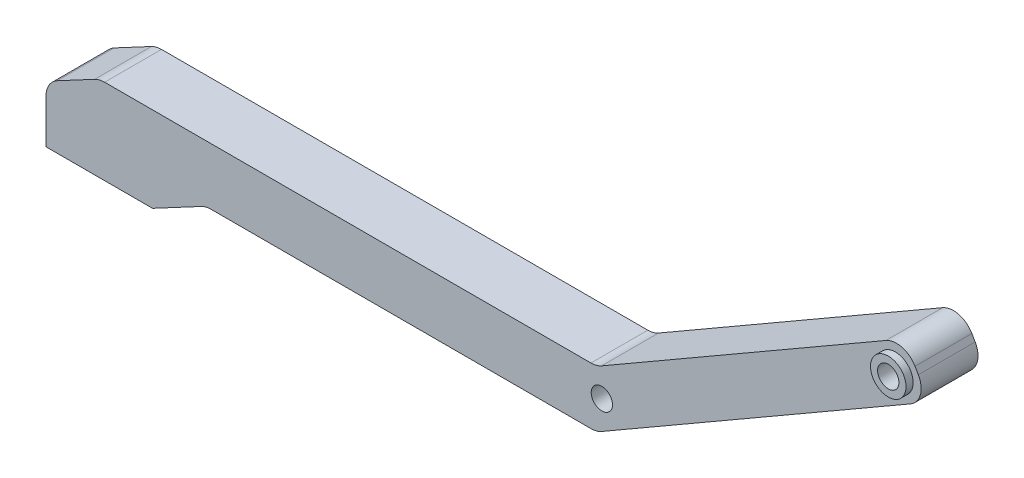
ISO-10303-21;
HEADER;
FILE_DESCRIPTION(('STEP AP214'),'2;1');
FILE_NAME('part.step','',(''),(''),'','','');
FILE_SCHEMA(('AUTOMOTIVE_DESIGN { 1 0 10303 214 1 1 1 1 }'));
ENDSEC;
DATA;
#1=APPLICATION_CONTEXT('core data for automotive mechanical design processes');
#2=APPLICATION_PROTOCOL_DEFINITION('international standard','automotive_design',2000,#1);
#3=PRODUCT_CONTEXT('',#1,'mechanical');
#4=PRODUCT('Part','Part','',(#3));
#5=PRODUCT_RELATED_PRODUCT_CATEGORY('part','',(#4));
#6=PRODUCT_DEFINITION_FORMATION('','',#4);
#7=PRODUCT_DEFINITION_CONTEXT('part definition',#1,'design');
#8=PRODUCT_DEFINITION('design','',#6,#7);
#9=PRODUCT_DEFINITION_SHAPE('','',#8);
#10=(LENGTH_UNIT() NAMED_UNIT(*) SI_UNIT(.MILLI.,.METRE.));
#11=(NAMED_UNIT(*) PLANE_ANGLE_UNIT() SI_UNIT($,.RADIAN.));
#12=(NAMED_UNIT(*) SI_UNIT($,.STERADIAN.) SOLID_ANGLE_UNIT());
#13=UNCERTAINTY_MEASURE_WITH_UNIT(LENGTH_MEASURE(1.E-05),#10,'distance_accuracy_value','');
#14=(GEOMETRIC_REPRESENTATION_CONTEXT(3) GLOBAL_UNCERTAINTY_ASSIGNED_CONTEXT((#13)) GLOBAL_UNIT_ASSIGNED_CONTEXT((#10,
#11,#12)) REPRESENTATION_CONTEXT('',''));
#15=CARTESIAN_POINT('',(0.,0.,0.));
#16=DIRECTION('',(0.,0.,1.));
#17=DIRECTION('',(1.,0.,0.));
#18=AXIS2_PLACEMENT_3D('',#15,#16,#17);
#19=CARTESIAN_POINT('',(0.,0.,8.));
#20=DIRECTION('',(0.,0.,1.));
#21=DIRECTION('',(1.,0.,0.));
#22=AXIS2_PLACEMENT_3D('',#19,#20,#21);
#23=PLANE('',#22);
#24=CARTESIAN_POINT('',(70.727461339179,4.42000000000001,8.));
#25=DIRECTION('',(0.,0.,1.));
#26=DIRECTION('',(1.,0.,0.));
#27=AXIS2_PLACEMENT_3D('',#24,#25,#26);
#28=CIRCLE('',#27,1.5);
#29=CARTESIAN_POINT('',(72.227461339179,4.42000000000001,8.));
#30=VERTEX_POINT('',#29);
#31=EDGE_CURVE('E351',#30,#30,#28,.T.);
#32=ORIENTED_EDGE('',*,*,#31,.F.);
#33=EDGE_LOOP('',(#32));
#34=FACE_BOUND('',#33,.T.);
#35=DIRECTION('',(-0.500000000000005,0.866025403784436,0.));
#36=VECTOR('',#35,1.);
#37=CARTESIAN_POINT('',(116.76537180436,27.,8.));
#38=LINE('',#37,#36);
#39=CARTESIAN_POINT('',(115.26537180436,29.5980762113533,8.));
#40=VERTEX_POINT('',#39);
#41=CARTESIAN_POINT('',(114.801270189222,30.4019237886467,8.));
#42=VERTEX_POINT('',#41);
#43=EDGE_CURVE('E333',#40,#42,#38,.T.);
#44=ORIENTED_EDGE('',*,*,#43,.T.);
#45=CARTESIAN_POINT('',(112.203193977869,28.9019237886467,8.));
#46=DIRECTION('',(0.,0.,1.));
#47=DIRECTION('',(1.,0.,0.));
#48=AXIS2_PLACEMENT_3D('',#45,#46,#47);
#49=CIRCLE('',#48,3.);
#50=CARTESIAN_POINT('',(110.703193977869,31.5,8.));
#51=VERTEX_POINT('',#50);
#52=EDGE_CURVE('E274',#42,#51,#49,.T.);
#53=ORIENTED_EDGE('',*,*,#52,.T.);
#54=DIRECTION('',(-0.866025403784439,-0.5,0.));
#55=VECTOR('',#54,1.);
#56=CARTESIAN_POINT('',(70.,8.,8.));
#57=LINE('',#56,#55);
#58=CARTESIAN_POINT('',(70.6961524227066,8.40192378864668,8.));
#59=VERTEX_POINT('',#58);
#60=EDGE_CURVE('E325',#51,#59,#57,.T.);
#61=ORIENTED_EDGE('',*,*,#60,.T.);
#62=CARTESIAN_POINT('',(69.1961524227066,11.,8.));
#63=DIRECTION('',(0.,0.,1.));
#64=DIRECTION('',(1.,0.,0.));
#65=AXIS2_PLACEMENT_3D('',#62,#63,#64);
#66=CIRCLE('',#65,3.);
#67=CARTESIAN_POINT('',(69.1961524227066,8.,8.));
#68=VERTEX_POINT('',#67);
#69=EDGE_CURVE('E11',#59,#68,#66,.F.);
#70=ORIENTED_EDGE('',*,*,#69,.T.);
#71=DIRECTION('',(-1.,0.,0.));
#72=VECTOR('',#71,1.);
#73=CARTESIAN_POINT('',(0.,8.,8.));
#74=LINE('',#73,#72);
#75=CARTESIAN_POINT('',(0.749999999999998,8.,8.));
#76=VERTEX_POINT('',#75);
#77=EDGE_CURVE('E323',#68,#76,#74,.T.);
#78=ORIENTED_EDGE('',*,*,#77,.T.);
#79=CARTESIAN_POINT('',(0.749999999999998,5.,8.));
#80=DIRECTION('',(0.,0.,1.));
#81=DIRECTION('',(1.,0.,0.));
#82=AXIS2_PLACEMENT_3D('',#79,#80,#81);
#83=CIRCLE('',#82,3.);
#84=CARTESIAN_POINT('',(-0.661764705882354,7.64705882352941,8.));
#85=VERTEX_POINT('',#84);
#86=EDGE_CURVE('E265',#76,#85,#83,.T.);
#87=ORIENTED_EDGE('',*,*,#86,.T.);
#88=DIRECTION('',(-0.882352941176471,-0.470588235294118,0.));
#89=VECTOR('',#88,1.);
#90=CARTESIAN_POINT('',(0.,8.,8.));
#91=LINE('',#90,#89);
#92=CARTESIAN_POINT('',(-5.91176470588236,4.84705882352941,8.));
#93=VERTEX_POINT('',#92);
#94=EDGE_CURVE('E169',#85,#93,#91,.T.);
#95=ORIENTED_EDGE('',*,*,#94,.T.);
#96=CARTESIAN_POINT('',(-4.5,2.2,8.));
#97=DIRECTION('',(0.,0.,1.));
#98=DIRECTION('',(1.,0.,0.));
#99=AXIS2_PLACEMENT_3D('',#96,#97,#98);
#100=CIRCLE('',#99,3.);
#101=CARTESIAN_POINT('',(-7.5,2.2,8.));
#102=VERTEX_POINT('',#101);
#103=EDGE_CURVE('E61',#93,#102,#100,.T.);
#104=ORIENTED_EDGE('',*,*,#103,.T.);
#105=DIRECTION('',(0.,-1.,0.));
#106=VECTOR('',#105,1.);
#107=CARTESIAN_POINT('',(-7.5,4.,8.));
#108=LINE('',#107,#106);
#109=CARTESIAN_POINT('',(-7.5,-4.,8.));
#110=VERTEX_POINT('',#109);
#111=EDGE_CURVE('E157',#102,#110,#108,.T.);
#112=ORIENTED_EDGE('',*,*,#111,.T.);
#113=DIRECTION('',(1.,0.,0.));
#114=VECTOR('',#113,1.);
#115=CARTESIAN_POINT('',(-7.5,-4.,8.));
#116=LINE('',#115,#114);
#117=CARTESIAN_POINT('',(7.5,-4.,8.));
#118=VERTEX_POINT('',#117);
#119=EDGE_CURVE('E163',#110,#118,#116,.T.);
#120=ORIENTED_EDGE('',*,*,#119,.T.);
#121=DIRECTION('',(0.882352941176471,0.470588235294118,0.));
#122=VECTOR('',#121,1.);
#123=CARTESIAN_POINT('',(7.5,-4.,8.));
#124=LINE('',#123,#122);
#125=CARTESIAN_POINT('',(14.3382352941176,-0.352941176470585,8.));
#126=VERTEX_POINT('',#125);
#127=EDGE_CURVE('E223',#118,#126,#124,.T.);
#128=ORIENTED_EDGE('',*,*,#127,.T.);
#129=CARTESIAN_POINT('',(15.75,-3.,8.));
#130=DIRECTION('',(0.,0.,1.));
#131=DIRECTION('',(1.,0.,0.));
#132=AXIS2_PLACEMENT_3D('',#129,#130,#131);
#133=CIRCLE('',#132,3.);
#134=CARTESIAN_POINT('',(15.75,0.,8.));
#135=VERTEX_POINT('',#134);
#136=EDGE_CURVE('E303',#126,#135,#133,.F.);
#137=ORIENTED_EDGE('',*,*,#136,.T.);
#138=DIRECTION('',(1.,0.,0.));
#139=VECTOR('',#138,1.);
#140=CARTESIAN_POINT('',(15.,0.,8.));
#141=LINE('',#140,#139);
#142=CARTESIAN_POINT('',(69.1961524227066,0.,8.));
#143=VERTEX_POINT('',#142);
#144=EDGE_CURVE('E342',#135,#143,#141,.T.);
#145=ORIENTED_EDGE('',*,*,#144,.T.);
#146=CARTESIAN_POINT('',(69.1961524227066,3.,8.));
#147=DIRECTION('',(0.,0.,1.));
#148=DIRECTION('',(1.,0.,0.));
#149=AXIS2_PLACEMENT_3D('',#146,#147,#148);
#150=CIRCLE('',#149,3.);
#151=CARTESIAN_POINT('',(70.6961524227066,0.40192378864668,8.));
#152=VERTEX_POINT('',#151);
#153=EDGE_CURVE('E268',#143,#152,#150,.T.);
#154=ORIENTED_EDGE('',*,*,#153,.T.);
#155=DIRECTION('',(0.866025403784439,0.5,0.));
#156=VECTOR('',#155,1.);
#157=CARTESIAN_POINT('',(70.,0.,8.));
#158=LINE('',#157,#156);
#159=CARTESIAN_POINT('',(114.167295593006,25.5,8.));
#160=VERTEX_POINT('',#159);
#161=EDGE_CURVE('E338',#152,#160,#158,.T.);
#162=ORIENTED_EDGE('',*,*,#161,.T.);
#163=CARTESIAN_POINT('',(112.667295593006,28.0980762113533,8.));
#164=DIRECTION('',(0.,0.,1.));
#165=DIRECTION('',(1.,0.,0.));
#166=AXIS2_PLACEMENT_3D('',#163,#164,#165);
#167=CIRCLE('',#166,3.);
#168=EDGE_CURVE('E271',#160,#40,#167,.T.);
#169=ORIENTED_EDGE('',*,*,#168,.T.);
#170=EDGE_LOOP('',(#44,#53,#61,#70,#78,#87,#95,#104,#112,#120,#128,#137,#145,#154,#162,#169));
#171=FACE_BOUND('',#170,.T.);
#172=CARTESIAN_POINT('',(112.036873099697,28.27,8.));
#173=DIRECTION('',(0.,0.,1.));
#174=DIRECTION('',(1.,0.,0.));
#175=AXIS2_PLACEMENT_3D('',#172,#173,#174);
#176=CIRCLE('',#175,2.5);
#177=CARTESIAN_POINT('',(114.536873099697,28.27,8.));
#178=VERTEX_POINT('',#177);
#179=EDGE_CURVE('E360',#178,#178,#176,.T.);
#180=ORIENTED_EDGE('',*,*,#179,.F.);
#181=EDGE_LOOP('',(#180));
#182=FACE_BOUND('',#181,.T.);
#183=ADVANCED_FACE('F45',(#34,#171,#182),#23,.T.);
#184=CARTESIAN_POINT('',(0.,0.,0.));
#185=DIRECTION('',(0.,0.,1.));
#186=DIRECTION('',(1.,0.,0.));
#187=AXIS2_PLACEMENT_3D('',#184,#185,#186);
#188=PLANE('',#187);
#189=DIRECTION('',(-0.866025403784439,-0.5,0.));
#190=VECTOR('',#189,1.);
#191=CARTESIAN_POINT('',(70.,8.,0.));
#192=LINE('',#191,#190);
#193=CARTESIAN_POINT('',(110.703193977869,31.5,0.));
#194=VERTEX_POINT('',#193);
#195=CARTESIAN_POINT('',(70.6961524227066,8.40192378864668,0.));
#196=VERTEX_POINT('',#195);
#197=EDGE_CURVE('E208',#194,#196,#192,.T.);
#198=ORIENTED_EDGE('',*,*,#197,.F.);
#199=CARTESIAN_POINT('',(112.203193977869,28.9019237886467,0.));
#200=DIRECTION('',(0.,0.,1.));
#201=DIRECTION('',(1.,0.,0.));
#202=AXIS2_PLACEMENT_3D('',#199,#200,#201);
#203=CIRCLE('',#202,3.);
#204=CARTESIAN_POINT('',(114.801270189222,30.4019237886467,0.));
#205=VERTEX_POINT('',#204);
#206=EDGE_CURVE('E253',#194,#205,#203,.F.);
#207=ORIENTED_EDGE('',*,*,#206,.T.);
#208=DIRECTION('',(-0.500000000000005,0.866025403784436,0.));
#209=VECTOR('',#208,1.);
#210=CARTESIAN_POINT('',(116.76537180436,27.,0.));
#211=LINE('',#210,#209);
#212=CARTESIAN_POINT('',(115.26537180436,29.5980762113533,0.));
#213=VERTEX_POINT('',#212);
#214=EDGE_CURVE('E204',#213,#205,#211,.T.);
#215=ORIENTED_EDGE('',*,*,#214,.F.);
#216=CARTESIAN_POINT('',(112.667295593006,28.0980762113533,0.));
#217=DIRECTION('',(0.,0.,1.));
#218=DIRECTION('',(1.,0.,0.));
#219=AXIS2_PLACEMENT_3D('',#216,#217,#218);
#220=CIRCLE('',#219,3.);
#221=CARTESIAN_POINT('',(114.167295593006,25.5,0.));
#222=VERTEX_POINT('',#221);
#223=EDGE_CURVE('E250',#213,#222,#220,.F.);
#224=ORIENTED_EDGE('',*,*,#223,.T.);
#225=DIRECTION('',(0.866025403784439,0.5,0.));
#226=VECTOR('',#225,1.);
#227=CARTESIAN_POINT('',(70.,0.,0.));
#228=LINE('',#227,#226);
#229=CARTESIAN_POINT('',(70.6961524227066,0.40192378864668,0.));
#230=VERTEX_POINT('',#229);
#231=EDGE_CURVE('E200',#230,#222,#228,.T.);
#232=ORIENTED_EDGE('',*,*,#231,.F.);
#233=CARTESIAN_POINT('',(69.1961524227066,3.,0.));
#234=DIRECTION('',(0.,0.,1.));
#235=DIRECTION('',(1.,0.,0.));
#236=AXIS2_PLACEMENT_3D('',#233,#234,#235);
#237=CIRCLE('',#236,3.);
#238=CARTESIAN_POINT('',(69.1961524227066,0.,0.));
#239=VERTEX_POINT('',#238);
#240=EDGE_CURVE('E247',#230,#239,#237,.F.);
#241=ORIENTED_EDGE('',*,*,#240,.T.);
#242=DIRECTION('',(1.,0.,0.));
#243=VECTOR('',#242,1.);
#244=CARTESIAN_POINT('',(15.,0.,0.));
#245=LINE('',#244,#243);
#246=CARTESIAN_POINT('',(15.75,0.,0.));
#247=VERTEX_POINT('',#246);
#248=EDGE_CURVE('E195',#247,#239,#245,.T.);
#249=ORIENTED_EDGE('',*,*,#248,.F.);
#250=CARTESIAN_POINT('',(15.75,-3.,0.));
#251=DIRECTION('',(0.,0.,1.));
#252=DIRECTION('',(1.,0.,0.));
#253=AXIS2_PLACEMENT_3D('',#250,#251,#252);
#254=CIRCLE('',#253,3.);
#255=CARTESIAN_POINT('',(14.3382352941176,-0.352941176470585,0.));
#256=VERTEX_POINT('',#255);
#257=EDGE_CURVE('E300',#247,#256,#254,.T.);
#258=ORIENTED_EDGE('',*,*,#257,.T.);
#259=DIRECTION('',(0.882352941176471,0.470588235294118,0.));
#260=VECTOR('',#259,1.);
#261=CARTESIAN_POINT('',(7.5,-4.,0.));
#262=LINE('',#261,#260);
#263=CARTESIAN_POINT('',(7.5,-4.,0.));
#264=VERTEX_POINT('',#263);
#265=EDGE_CURVE('E191',#264,#256,#262,.T.);
#266=ORIENTED_EDGE('',*,*,#265,.F.);
#267=DIRECTION('',(1.,0.,0.));
#268=VECTOR('',#267,1.);
#269=CARTESIAN_POINT('',(-7.5,-4.,0.));
#270=LINE('',#269,#268);
#271=CARTESIAN_POINT('',(-7.5,-4.,0.));
#272=VERTEX_POINT('',#271);
#273=EDGE_CURVE('E221',#272,#264,#270,.T.);
#274=ORIENTED_EDGE('',*,*,#273,.F.);
#275=DIRECTION('',(0.,-1.,0.));
#276=VECTOR('',#275,1.);
#277=CARTESIAN_POINT('',(-7.5,4.,0.));
#278=LINE('',#277,#276);
#279=CARTESIAN_POINT('',(-7.5,2.2,0.));
#280=VERTEX_POINT('',#279);
#281=EDGE_CURVE('E175',#280,#272,#278,.T.);
#282=ORIENTED_EDGE('',*,*,#281,.F.);
#283=CARTESIAN_POINT('',(-4.5,2.2,0.));
#284=DIRECTION('',(0.,0.,1.));
#285=DIRECTION('',(1.,0.,0.));
#286=AXIS2_PLACEMENT_3D('',#283,#284,#285);
#287=CIRCLE('',#286,3.);
#288=CARTESIAN_POINT('',(-5.91176470588236,4.84705882352941,0.));
#289=VERTEX_POINT('',#288);
#290=EDGE_CURVE('E241',#280,#289,#287,.F.);
#291=ORIENTED_EDGE('',*,*,#290,.T.);
#292=DIRECTION('',(-0.882352941176471,-0.470588235294118,0.));
#293=VECTOR('',#292,1.);
#294=CARTESIAN_POINT('',(0.,8.,0.));
#295=LINE('',#294,#293);
#296=CARTESIAN_POINT('',(-0.661764705882354,7.64705882352941,0.));
#297=VERTEX_POINT('',#296);
#298=EDGE_CURVE('E216',#297,#289,#295,.T.);
#299=ORIENTED_EDGE('',*,*,#298,.F.);
#300=CARTESIAN_POINT('',(0.749999999999998,5.,0.));
#301=DIRECTION('',(0.,0.,1.));
#302=DIRECTION('',(1.,0.,0.));
#303=AXIS2_PLACEMENT_3D('',#300,#301,#302);
#304=CIRCLE('',#303,3.);
#305=CARTESIAN_POINT('',(0.749999999999998,8.,0.));
#306=VERTEX_POINT('',#305);
#307=EDGE_CURVE('E244',#297,#306,#304,.F.);
#308=ORIENTED_EDGE('',*,*,#307,.T.);
#309=DIRECTION('',(-1.,0.,0.));
#310=VECTOR('',#309,1.);
#311=CARTESIAN_POINT('',(0.,8.,0.));
#312=LINE('',#311,#310);
#313=CARTESIAN_POINT('',(69.1961524227066,8.,0.));
#314=VERTEX_POINT('',#313);
#315=EDGE_CURVE('E212',#314,#306,#312,.T.);
#316=ORIENTED_EDGE('',*,*,#315,.F.);
#317=CARTESIAN_POINT('',(69.1961524227066,11.,0.));
#318=DIRECTION('',(0.,0.,1.));
#319=DIRECTION('',(1.,0.,0.));
#320=AXIS2_PLACEMENT_3D('',#317,#318,#319);
#321=CIRCLE('',#320,3.);
#322=EDGE_CURVE('E54',#314,#196,#321,.T.);
#323=ORIENTED_EDGE('',*,*,#322,.T.);
#324=EDGE_LOOP('',(#198,#207,#215,#224,#232,#241,#249,#258,#266,#274,#282,#291,#299,#308,#316,#323));
#325=FACE_BOUND('',#324,.T.);
#326=CARTESIAN_POINT('',(112.036873099697,28.27,0.));
#327=DIRECTION('',(0.,0.,1.));
#328=DIRECTION('',(1.,0.,0.));
#329=AXIS2_PLACEMENT_3D('',#326,#327,#328);
#330=CIRCLE('',#329,1.5);
#331=CARTESIAN_POINT('',(113.536873099697,28.27,0.));
#332=VERTEX_POINT('',#331);
#333=EDGE_CURVE('E196',#332,#332,#330,.T.);
#334=ORIENTED_EDGE('',*,*,#333,.T.);
#335=EDGE_LOOP('',(#334));
#336=FACE_BOUND('',#335,.T.);
#337=CARTESIAN_POINT('',(70.727461339179,4.42000000000001,0.));
#338=DIRECTION('',(0.,0.,1.));
#339=DIRECTION('',(1.,0.,0.));
#340=AXIS2_PLACEMENT_3D('',#337,#338,#339);
#341=CIRCLE('',#340,1.5);
#342=CARTESIAN_POINT('',(72.227461339179,4.42000000000001,0.));
#343=VERTEX_POINT('',#342);
#344=EDGE_CURVE('E352',#343,#343,#341,.T.);
#345=ORIENTED_EDGE('',*,*,#344,.T.);
#346=EDGE_LOOP('',(#345));
#347=FACE_BOUND('',#346,.T.);
#348=ADVANCED_FACE('F309',(#325,#336,#347),#188,.F.);
#349=CARTESIAN_POINT('',(7.5,-4.,8.));
#350=DIRECTION('',(-0.470588235294118,0.88235294117647,0.));
#351=DIRECTION('',(-0.882352941176471,-0.470588235294118,0.));
#352=AXIS2_PLACEMENT_3D('',#349,#350,#351);
#353=PLANE('',#352);
#354=ORIENTED_EDGE('',*,*,#265,.T.);
#355=DIRECTION('',(0.,0.,-1.));
#356=VECTOR('',#355,1.);
#357=CARTESIAN_POINT('',(14.3382352941176,-0.352941176470586,8.));
#358=LINE('',#357,#356);
#359=EDGE_CURVE('E231',#256,#126,#358,.F.);
#360=ORIENTED_EDGE('',*,*,#359,.T.);
#361=ORIENTED_EDGE('',*,*,#127,.F.);
#362=DIRECTION('',(0.,0.,-1.));
#363=VECTOR('',#362,1.);
#364=CARTESIAN_POINT('',(7.5,-4.,8.));
#365=LINE('',#364,#363);
#366=EDGE_CURVE('E180',#118,#264,#365,.T.);
#367=ORIENTED_EDGE('',*,*,#366,.T.);
#368=EDGE_LOOP('',(#354,#360,#361,#367));
#369=FACE_BOUND('',#368,.T.);
#370=ADVANCED_FACE('F394',(#369),#353,.F.);
#371=CARTESIAN_POINT('',(15.,0.,8.));
#372=DIRECTION('',(0.,1.,0.));
#373=DIRECTION('',(-1.,0.,0.));
#374=AXIS2_PLACEMENT_3D('',#371,#372,#373);
#375=PLANE('',#374);
#376=ORIENTED_EDGE('',*,*,#144,.F.);
#377=DIRECTION('',(0.,0.,-1.));
#378=VECTOR('',#377,1.);
#379=CARTESIAN_POINT('',(15.75,0.,0.));
#380=LINE('',#379,#378);
#381=EDGE_CURVE('E227',#135,#247,#380,.T.);
#382=ORIENTED_EDGE('',*,*,#381,.T.);
#383=ORIENTED_EDGE('',*,*,#248,.T.);
#384=DIRECTION('',(0.,0.,-1.));
#385=VECTOR('',#384,1.);
#386=CARTESIAN_POINT('',(69.1961524227066,0.,8.));
#387=LINE('',#386,#385);
#388=EDGE_CURVE('E179',#239,#143,#387,.F.);
#389=ORIENTED_EDGE('',*,*,#388,.T.);
#390=EDGE_LOOP('',(#376,#382,#383,#389));
#391=FACE_BOUND('',#390,.T.);
#392=ADVANCED_FACE('F418',(#391),#375,.F.);
#393=CARTESIAN_POINT('',(70.,0.,8.));
#394=DIRECTION('',(-0.5,0.866025403784439,0.));
#395=DIRECTION('',(-0.866025403784439,-0.5,0.));
#396=AXIS2_PLACEMENT_3D('',#393,#394,#395);
#397=PLANE('',#396);
#398=ORIENTED_EDGE('',*,*,#231,.T.);
#399=DIRECTION('',(0.,0.,-1.));
#400=VECTOR('',#399,1.);
#401=CARTESIAN_POINT('',(114.167295593006,25.5,8.));
#402=LINE('',#401,#400);
#403=EDGE_CURVE('E281',#222,#160,#402,.F.);
#404=ORIENTED_EDGE('',*,*,#403,.T.);
#405=ORIENTED_EDGE('',*,*,#161,.F.);
#406=DIRECTION('',(0.,0.,-1.));
#407=VECTOR('',#406,1.);
#408=CARTESIAN_POINT('',(70.6961524227066,0.401923788646679,8.));
#409=LINE('',#408,#407);
#410=EDGE_CURVE('E277',#152,#230,#409,.T.);
#411=ORIENTED_EDGE('',*,*,#410,.T.);
#412=EDGE_LOOP('',(#398,#404,#405,#411));
#413=FACE_BOUND('',#412,.T.);
#414=ADVANCED_FACE('F414',(#413),#397,.F.);
#415=CARTESIAN_POINT('',(116.76537180436,27.,8.));
#416=DIRECTION('',(-0.866025403784436,-0.500000000000004,0.));
#417=DIRECTION('',(0.500000000000005,-0.866025403784436,0.));
#418=AXIS2_PLACEMENT_3D('',#415,#416,#417);
#419=PLANE('',#418);
#420=ORIENTED_EDGE('',*,*,#214,.T.);
#421=DIRECTION('',(0.,0.,-1.));
#422=VECTOR('',#421,1.);
#423=CARTESIAN_POINT('',(114.801270189222,30.4019237886467,8.));
#424=LINE('',#423,#422);
#425=EDGE_CURVE('E260',#205,#42,#424,.F.);
#426=ORIENTED_EDGE('',*,*,#425,.T.);
#427=ORIENTED_EDGE('',*,*,#43,.F.);
#428=DIRECTION('',(0.,0.,-1.));
#429=VECTOR('',#428,1.);
#430=CARTESIAN_POINT('',(115.26537180436,29.5980762113533,8.));
#431=LINE('',#430,#429);
#432=EDGE_CURVE('E256',#40,#213,#431,.T.);
#433=ORIENTED_EDGE('',*,*,#432,.T.);
#434=EDGE_LOOP('',(#420,#426,#427,#433));
#435=FACE_BOUND('',#434,.T.);
#436=ADVANCED_FACE('F411',(#435),#419,.F.);
#437=CARTESIAN_POINT('',(70.,8.,8.));
#438=DIRECTION('',(0.5,-0.866025403784439,0.));
#439=DIRECTION('',(0.866025403784439,0.5,0.));
#440=AXIS2_PLACEMENT_3D('',#437,#438,#439);
#441=PLANE('',#440);
#442=ORIENTED_EDGE('',*,*,#60,.F.);
#443=DIRECTION('',(0.,0.,-1.));
#444=VECTOR('',#443,1.);
#445=CARTESIAN_POINT('',(110.703193977869,31.5,8.));
#446=LINE('',#445,#444);
#447=EDGE_CURVE('E237',#51,#194,#446,.T.);
#448=ORIENTED_EDGE('',*,*,#447,.T.);
#449=ORIENTED_EDGE('',*,*,#197,.T.);
#450=DIRECTION('',(0.,0.,-1.));
#451=VECTOR('',#450,1.);
#452=CARTESIAN_POINT('',(70.6961524227066,8.40192378864668,8.));
#453=LINE('',#452,#451);
#454=EDGE_CURVE('E234',#196,#59,#453,.F.);
#455=ORIENTED_EDGE('',*,*,#454,.T.);
#456=EDGE_LOOP('',(#442,#448,#449,#455));
#457=FACE_BOUND('',#456,.T.);
#458=ADVANCED_FACE('F316',(#457),#441,.F.);
#459=CARTESIAN_POINT('',(0.,8.,8.));
#460=DIRECTION('',(0.,-1.,0.));
#461=DIRECTION('',(0.,0.,-1.));
#462=AXIS2_PLACEMENT_3D('',#459,#460,#461);
#463=PLANE('',#462);
#464=ORIENTED_EDGE('',*,*,#77,.F.);
#465=DIRECTION('',(0.,0.,-1.));
#466=VECTOR('',#465,1.);
#467=CARTESIAN_POINT('',(69.1961524227066,8.,0.));
#468=LINE('',#467,#466);
#469=EDGE_CURVE('E287',#68,#314,#468,.T.);
#470=ORIENTED_EDGE('',*,*,#469,.T.);
#471=ORIENTED_EDGE('',*,*,#315,.T.);
#472=DIRECTION('',(0.,0.,-1.));
#473=VECTOR('',#472,1.);
#474=CARTESIAN_POINT('',(0.749999999999998,8.,8.));
#475=LINE('',#474,#473);
#476=EDGE_CURVE('E284',#306,#76,#475,.F.);
#477=ORIENTED_EDGE('',*,*,#476,.T.);
#478=EDGE_LOOP('',(#464,#470,#471,#477));
#479=FACE_BOUND('',#478,.T.);
#480=ADVANCED_FACE('F327',(#479),#463,.F.);
#481=CARTESIAN_POINT('',(0.,8.,8.));
#482=DIRECTION('',(0.470588235294118,-0.882352941176471,0.));
#483=DIRECTION('',(0.882352941176471,0.470588235294118,0.));
#484=AXIS2_PLACEMENT_3D('',#481,#482,#483);
#485=PLANE('',#484);
#486=ORIENTED_EDGE('',*,*,#94,.F.);
#487=DIRECTION('',(0.,0.,-1.));
#488=VECTOR('',#487,1.);
#489=CARTESIAN_POINT('',(-0.661764705882354,7.64705882352941,8.));
#490=LINE('',#489,#488);
#491=EDGE_CURVE('E293',#85,#297,#490,.T.);
#492=ORIENTED_EDGE('',*,*,#491,.T.);
#493=ORIENTED_EDGE('',*,*,#298,.T.);
#494=DIRECTION('',(0.,0.,-1.));
#495=VECTOR('',#494,1.);
#496=CARTESIAN_POINT('',(-5.91176470588236,4.84705882352941,8.));
#497=LINE('',#496,#495);
#498=EDGE_CURVE('E69',#289,#93,#497,.F.);
#499=ORIENTED_EDGE('',*,*,#498,.T.);
#500=EDGE_LOOP('',(#486,#492,#493,#499));
#501=FACE_BOUND('',#500,.T.);
#502=ADVANCED_FACE('F404',(#501),#485,.F.);
#503=CARTESIAN_POINT('',(-7.5,4.,8.));
#504=DIRECTION('',(1.,0.,0.));
#505=DIRECTION('',(0.,0.,-1.));
#506=AXIS2_PLACEMENT_3D('',#503,#504,#505);
#507=PLANE('',#506);
#508=ORIENTED_EDGE('',*,*,#111,.F.);
#509=DIRECTION('',(0.,0.,-1.));
#510=VECTOR('',#509,1.);
#511=CARTESIAN_POINT('',(-7.5,2.2,8.));
#512=LINE('',#511,#510);
#513=EDGE_CURVE('E297',#102,#280,#512,.T.);
#514=ORIENTED_EDGE('',*,*,#513,.T.);
#515=ORIENTED_EDGE('',*,*,#281,.T.);
#516=DIRECTION('',(0.,0.,-1.));
#517=VECTOR('',#516,1.);
#518=CARTESIAN_POINT('',(-7.5,-4.,8.));
#519=LINE('',#518,#517);
#520=EDGE_CURVE('E172',#110,#272,#519,.T.);
#521=ORIENTED_EDGE('',*,*,#520,.F.);
#522=EDGE_LOOP('',(#508,#514,#515,#521));
#523=FACE_BOUND('',#522,.T.);
#524=ADVANCED_FACE('F173',(#523),#507,.F.);
#525=CARTESIAN_POINT('',(-7.5,-4.,8.));
#526=DIRECTION('',(0.,1.,0.));
#527=DIRECTION('',(0.,0.,1.));
#528=AXIS2_PLACEMENT_3D('',#525,#526,#527);
#529=PLANE('',#528);
#530=ORIENTED_EDGE('',*,*,#273,.T.);
#531=ORIENTED_EDGE('',*,*,#366,.F.);
#532=ORIENTED_EDGE('',*,*,#119,.F.);
#533=ORIENTED_EDGE('',*,*,#520,.T.);
#534=EDGE_LOOP('',(#530,#531,#532,#533));
#535=FACE_BOUND('',#534,.T.);
#536=ADVANCED_FACE('F182',(#535),#529,.F.);
#537=CARTESIAN_POINT('',(112.036873099697,28.27,8.));
#538=DIRECTION('',(0.,0.,-1.));
#539=DIRECTION('',(-1.,0.,0.));
#540=AXIS2_PLACEMENT_3D('',#537,#538,#539);
#541=CYLINDRICAL_SURFACE('',#540,1.5);
#542=ORIENTED_EDGE('',*,*,#333,.F.);
#543=EDGE_LOOP('',(#542));
#544=FACE_BOUND('',#543,.T.);
#545=CARTESIAN_POINT('',(112.036873099697,28.27,9.));
#546=DIRECTION('',(0.,0.,1.));
#547=DIRECTION('',(1.,0.,0.));
#548=AXIS2_PLACEMENT_3D('',#545,#546,#547);
#549=CIRCLE('',#548,1.5);
#550=CARTESIAN_POINT('',(113.536873099697,28.27,9.));
#551=VERTEX_POINT('',#550);
#552=EDGE_CURVE('E364',#551,#551,#549,.T.);
#553=ORIENTED_EDGE('',*,*,#552,.T.);
#554=EDGE_LOOP('',(#553));
#555=FACE_BOUND('',#554,.T.);
#556=ADVANCED_FACE('F372',(#544,#555),#541,.F.);
#557=CARTESIAN_POINT('',(70.727461339179,4.42000000000001,8.));
#558=DIRECTION('',(0.,0.,-1.));
#559=DIRECTION('',(-1.,0.,0.));
#560=AXIS2_PLACEMENT_3D('',#557,#558,#559);
#561=CYLINDRICAL_SURFACE('',#560,1.5);
#562=ORIENTED_EDGE('',*,*,#31,.T.);
#563=EDGE_LOOP('',(#562));
#564=FACE_BOUND('',#563,.T.);
#565=ORIENTED_EDGE('',*,*,#344,.F.);
#566=EDGE_LOOP('',(#565));
#567=FACE_BOUND('',#566,.T.);
#568=ADVANCED_FACE('F430',(#564,#567),#561,.F.);
#569=CARTESIAN_POINT('',(15.75,-3.,8.));
#570=DIRECTION('',(0.,0.,1.));
#571=DIRECTION('',(1.,0.,0.));
#572=AXIS2_PLACEMENT_3D('',#569,#570,#571);
#573=CYLINDRICAL_SURFACE('',#572,3.);
#574=ORIENTED_EDGE('',*,*,#136,.F.);
#575=ORIENTED_EDGE('',*,*,#359,.F.);
#576=ORIENTED_EDGE('',*,*,#257,.F.);
#577=ORIENTED_EDGE('',*,*,#381,.F.);
#578=EDGE_LOOP('',(#574,#575,#576,#577));
#579=FACE_BOUND('',#578,.T.);
#580=ADVANCED_FACE('F426',(#579),#573,.F.);
#581=CARTESIAN_POINT('',(112.203193977869,28.9019237886467,8.));
#582=DIRECTION('',(0.,0.,-1.));
#583=DIRECTION('',(-1.,0.,0.));
#584=AXIS2_PLACEMENT_3D('',#581,#582,#583);
#585=CYLINDRICAL_SURFACE('',#584,3.);
#586=ORIENTED_EDGE('',*,*,#52,.F.);
#587=ORIENTED_EDGE('',*,*,#425,.F.);
#588=ORIENTED_EDGE('',*,*,#206,.F.);
#589=ORIENTED_EDGE('',*,*,#447,.F.);
#590=EDGE_LOOP('',(#586,#587,#588,#589));
#591=FACE_BOUND('',#590,.T.);
#592=ADVANCED_FACE('F429',(#591),#585,.T.);
#593=CARTESIAN_POINT('',(112.667295593006,28.0980762113533,8.));
#594=DIRECTION('',(0.,0.,-1.));
#595=DIRECTION('',(-1.,0.,0.));
#596=AXIS2_PLACEMENT_3D('',#593,#594,#595);
#597=CYLINDRICAL_SURFACE('',#596,3.);
#598=ORIENTED_EDGE('',*,*,#168,.F.);
#599=ORIENTED_EDGE('',*,*,#403,.F.);
#600=ORIENTED_EDGE('',*,*,#223,.F.);
#601=ORIENTED_EDGE('',*,*,#432,.F.);
#602=EDGE_LOOP('',(#598,#599,#600,#601));
#603=FACE_BOUND('',#602,.T.);
#604=ADVANCED_FACE('F434',(#603),#597,.T.);
#605=CARTESIAN_POINT('',(69.1961524227066,3.,8.));
#606=DIRECTION('',(0.,0.,-1.));
#607=DIRECTION('',(-1.,0.,0.));
#608=AXIS2_PLACEMENT_3D('',#605,#606,#607);
#609=CYLINDRICAL_SURFACE('',#608,3.);
#610=ORIENTED_EDGE('',*,*,#153,.F.);
#611=ORIENTED_EDGE('',*,*,#388,.F.);
#612=ORIENTED_EDGE('',*,*,#240,.F.);
#613=ORIENTED_EDGE('',*,*,#410,.F.);
#614=EDGE_LOOP('',(#610,#611,#612,#613));
#615=FACE_BOUND('',#614,.T.);
#616=ADVANCED_FACE('F438',(#615),#609,.T.);
#617=CARTESIAN_POINT('',(69.1961524227066,11.,8.));
#618=DIRECTION('',(0.,0.,1.));
#619=DIRECTION('',(1.,0.,0.));
#620=AXIS2_PLACEMENT_3D('',#617,#618,#619);
#621=CYLINDRICAL_SURFACE('',#620,3.);
#622=ORIENTED_EDGE('',*,*,#69,.F.);
#623=ORIENTED_EDGE('',*,*,#454,.F.);
#624=ORIENTED_EDGE('',*,*,#322,.F.);
#625=ORIENTED_EDGE('',*,*,#469,.F.);
#626=EDGE_LOOP('',(#622,#623,#624,#625));
#627=FACE_BOUND('',#626,.T.);
#628=ADVANCED_FACE('F320',(#627),#621,.F.);
#629=CARTESIAN_POINT('',(0.749999999999998,5.,8.));
#630=DIRECTION('',(0.,0.,-1.));
#631=DIRECTION('',(-1.,0.,0.));
#632=AXIS2_PLACEMENT_3D('',#629,#630,#631);
#633=CYLINDRICAL_SURFACE('',#632,3.);
#634=ORIENTED_EDGE('',*,*,#86,.F.);
#635=ORIENTED_EDGE('',*,*,#476,.F.);
#636=ORIENTED_EDGE('',*,*,#307,.F.);
#637=ORIENTED_EDGE('',*,*,#491,.F.);
#638=EDGE_LOOP('',(#634,#635,#636,#637));
#639=FACE_BOUND('',#638,.T.);
#640=ADVANCED_FACE('F386',(#639),#633,.T.);
#641=CARTESIAN_POINT('',(-4.5,2.2,8.));
#642=DIRECTION('',(0.,0.,-1.));
#643=DIRECTION('',(-1.,0.,0.));
#644=AXIS2_PLACEMENT_3D('',#641,#642,#643);
#645=CYLINDRICAL_SURFACE('',#644,3.);
#646=ORIENTED_EDGE('',*,*,#103,.F.);
#647=ORIENTED_EDGE('',*,*,#498,.F.);
#648=ORIENTED_EDGE('',*,*,#290,.F.);
#649=ORIENTED_EDGE('',*,*,#513,.F.);
#650=EDGE_LOOP('',(#646,#647,#648,#649));
#651=FACE_BOUND('',#650,.T.);
#652=ADVANCED_FACE('F47',(#651),#645,.T.);
#653=CARTESIAN_POINT('',(112.036873099697,28.27,9.));
#654=DIRECTION('',(0.,0.,1.));
#655=DIRECTION('',(1.,0.,0.));
#656=AXIS2_PLACEMENT_3D('',#653,#654,#655);
#657=PLANE('',#656);
#658=CARTESIAN_POINT('',(112.036873099697,28.27,9.));
#659=DIRECTION('',(0.,0.,1.));
#660=DIRECTION('',(1.,0.,0.));
#661=AXIS2_PLACEMENT_3D('',#658,#659,#660);
#662=CIRCLE('',#661,2.5);
#663=CARTESIAN_POINT('',(114.536873099697,28.27,9.));
#664=VERTEX_POINT('',#663);
#665=EDGE_CURVE('E356',#664,#664,#662,.T.);
#666=ORIENTED_EDGE('',*,*,#665,.T.);
#667=EDGE_LOOP('',(#666));
#668=FACE_BOUND('',#667,.T.);
#669=ORIENTED_EDGE('',*,*,#552,.F.);
#670=EDGE_LOOP('',(#669));
#671=FACE_BOUND('',#670,.T.);
#672=ADVANCED_FACE('F374',(#668,#671),#657,.T.);
#673=CARTESIAN_POINT('',(112.036873099697,28.27,9.));
#674=DIRECTION('',(0.,0.,-1.));
#675=DIRECTION('',(-1.,0.,0.));
#676=AXIS2_PLACEMENT_3D('',#673,#674,#675);
#677=CYLINDRICAL_SURFACE('',#676,2.5);
#678=ORIENTED_EDGE('',*,*,#665,.F.);
#679=EDGE_LOOP('',(#678));
#680=FACE_BOUND('',#679,.T.);
#681=ORIENTED_EDGE('',*,*,#179,.T.);
#682=EDGE_LOOP('',(#681));
#683=FACE_BOUND('',#682,.T.);
#684=ADVANCED_FACE('F376',(#680,#683),#677,.T.);
#685=CLOSED_SHELL('',(#183,#348,#370,#392,#414,#436,#458,#480,#502,#524,#536,#556,#568,#580,
#592,#604,#616,#628,#640,#652,#672,#684));
#686=MANIFOLD_SOLID_BREP('B2',#685);
#687=ADVANCED_BREP_SHAPE_REPRESENTATION('',(#18,#686),#14);
#688=SHAPE_DEFINITION_REPRESENTATION(#9,#687);
ENDSEC;
END-ISO-10303-21;
